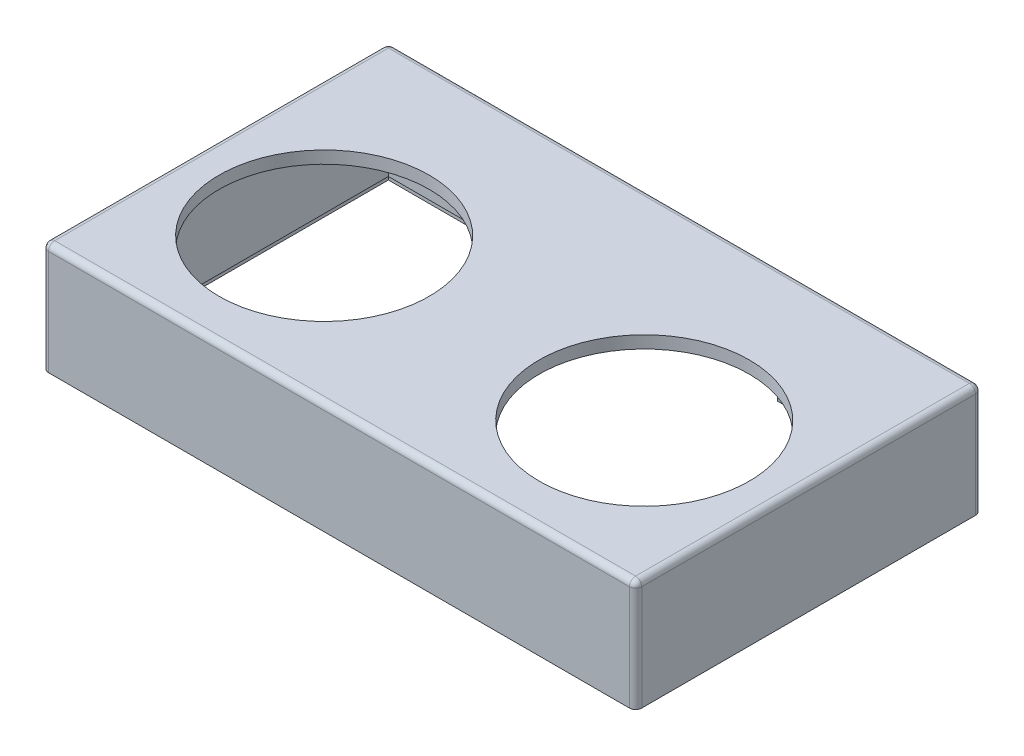
ISO-10303-21;
HEADER;
FILE_DESCRIPTION(('STEP AP214'),'2;1');
FILE_NAME('part.step','',(''),(''),'','','');
FILE_SCHEMA(('AUTOMOTIVE_DESIGN { 1 0 10303 214 1 1 1 1 }'));
ENDSEC;
DATA;
#1=APPLICATION_CONTEXT('core data for automotive mechanical design processes');
#2=APPLICATION_PROTOCOL_DEFINITION('international standard','automotive_design',2000,#1);
#3=PRODUCT_CONTEXT('',#1,'mechanical');
#4=PRODUCT('Part','Part','',(#3));
#5=PRODUCT_RELATED_PRODUCT_CATEGORY('part','',(#4));
#6=PRODUCT_DEFINITION_FORMATION('','',#4);
#7=PRODUCT_DEFINITION_CONTEXT('part definition',#1,'design');
#8=PRODUCT_DEFINITION('design','',#6,#7);
#9=PRODUCT_DEFINITION_SHAPE('','',#8);
#10=(LENGTH_UNIT() NAMED_UNIT(*) SI_UNIT(.MILLI.,.METRE.));
#11=(NAMED_UNIT(*) PLANE_ANGLE_UNIT() SI_UNIT($,.RADIAN.));
#12=(NAMED_UNIT(*) SI_UNIT($,.STERADIAN.) SOLID_ANGLE_UNIT());
#13=UNCERTAINTY_MEASURE_WITH_UNIT(LENGTH_MEASURE(1.E-05),#10,'distance_accuracy_value','');
#14=(GEOMETRIC_REPRESENTATION_CONTEXT(3) GLOBAL_UNCERTAINTY_ASSIGNED_CONTEXT((#13)) GLOBAL_UNIT_ASSIGNED_CONTEXT((#10,
#11,#12)) REPRESENTATION_CONTEXT('',''));
#15=CARTESIAN_POINT('',(0.,0.,0.));
#16=DIRECTION('',(0.,0.,1.));
#17=DIRECTION('',(1.,0.,0.));
#18=AXIS2_PLACEMENT_3D('',#15,#16,#17);
#19=CARTESIAN_POINT('',(-23.25,1.,-13.25));
#20=DIRECTION('',(0.,0.,-1.));
#21=DIRECTION('',(-1.,0.,0.));
#22=AXIS2_PLACEMENT_3D('',#19,#20,#21);
#23=PLANE('',#22);
#24=DIRECTION('',(1.,0.,0.));
#25=VECTOR('',#24,1.);
#26=CARTESIAN_POINT('',(-23.25,0.,-13.25));
#27=LINE('',#26,#25);
#28=CARTESIAN_POINT('',(-23.25,0.,-13.25));
#29=VERTEX_POINT('',#28);
#30=CARTESIAN_POINT('',(0.999999999999999,0.,-13.25));
#31=VERTEX_POINT('',#30);
#32=EDGE_CURVE('E708',#29,#31,#27,.T.);
#33=ORIENTED_EDGE('',*,*,#32,.T.);
#34=DIRECTION('',(0.,1.,0.));
#35=VECTOR('',#34,1.);
#36=CARTESIAN_POINT('',(0.999999999999997,1.,-13.25));
#37=LINE('',#36,#35);
#38=CARTESIAN_POINT('',(0.999999999999997,1.,-13.25));
#39=VERTEX_POINT('',#38);
#40=EDGE_CURVE('E202',#31,#39,#37,.T.);
#41=ORIENTED_EDGE('',*,*,#40,.T.);
#42=DIRECTION('',(1.,0.,0.));
#43=VECTOR('',#42,1.);
#44=CARTESIAN_POINT('',(-23.25,1.,-13.25));
#45=LINE('',#44,#43);
#46=CARTESIAN_POINT('',(-23.25,1.,-13.25));
#47=VERTEX_POINT('',#46);
#48=EDGE_CURVE('E715',#47,#39,#45,.T.);
#49=ORIENTED_EDGE('',*,*,#48,.F.);
#50=DIRECTION('',(0.,-1.,0.));
#51=VECTOR('',#50,1.);
#52=CARTESIAN_POINT('',(-23.25,1.,-13.25));
#53=LINE('',#52,#51);
#54=EDGE_CURVE('E732',#47,#29,#53,.T.);
#55=ORIENTED_EDGE('',*,*,#54,.T.);
#56=EDGE_LOOP('',(#33,#41,#49,#55));
#57=FACE_BOUND('',#56,.T.);
#58=ADVANCED_FACE('F35',(#57),#23,.F.);
#59=CARTESIAN_POINT('',(24.,9.,14.));
#60=DIRECTION('',(-1.,0.,0.));
#61=DIRECTION('',(0.,0.,1.));
#62=AXIS2_PLACEMENT_3D('',#59,#60,#61);
#63=PLANE('',#62);
#64=DIRECTION('',(0.,0.,-1.));
#65=VECTOR('',#64,1.);
#66=CARTESIAN_POINT('',(24.,0.,14.));
#67=LINE('',#66,#65);
#68=CARTESIAN_POINT('',(24.,0.,13.5));
#69=VERTEX_POINT('',#68);
#70=CARTESIAN_POINT('',(24.,0.,-13.5));
#71=VERTEX_POINT('',#70);
#72=EDGE_CURVE('E225',#69,#71,#67,.T.);
#73=ORIENTED_EDGE('',*,*,#72,.T.);
#74=DIRECTION('',(0.,-1.,0.));
#75=VECTOR('',#74,1.);
#76=CARTESIAN_POINT('',(24.,9.,-13.5));
#77=LINE('',#76,#75);
#78=CARTESIAN_POINT('',(24.,8.5,-13.5));
#79=VERTEX_POINT('',#78);
#80=EDGE_CURVE('E270',#71,#79,#77,.F.);
#81=ORIENTED_EDGE('',*,*,#80,.T.);
#82=DIRECTION('',(0.,0.,-1.));
#83=VECTOR('',#82,1.);
#84=CARTESIAN_POINT('',(24.,8.5,14.));
#85=LINE('',#84,#83);
#86=CARTESIAN_POINT('',(24.,8.5,13.5));
#87=VERTEX_POINT('',#86);
#88=EDGE_CURVE('E267',#79,#87,#85,.F.);
#89=ORIENTED_EDGE('',*,*,#88,.T.);
#90=DIRECTION('',(0.,-1.,0.));
#91=VECTOR('',#90,1.);
#92=CARTESIAN_POINT('',(24.,9.,13.5));
#93=LINE('',#92,#91);
#94=EDGE_CURVE('E265',#87,#69,#93,.T.);
#95=ORIENTED_EDGE('',*,*,#94,.T.);
#96=EDGE_LOOP('',(#73,#81,#89,#95));
#97=FACE_BOUND('',#96,.T.);
#98=ADVANCED_FACE('F383',(#97),#63,.F.);
#99=CARTESIAN_POINT('',(-24.,9.,-14.));
#100=DIRECTION('',(0.,0.,1.));
#101=DIRECTION('',(1.,0.,0.));
#102=AXIS2_PLACEMENT_3D('',#99,#100,#101);
#103=PLANE('',#102);
#104=DIRECTION('',(-1.,0.,0.));
#105=VECTOR('',#104,1.);
#106=CARTESIAN_POINT('',(-24.,8.5,-14.));
#107=LINE('',#106,#105);
#108=CARTESIAN_POINT('',(-23.5,8.5,-14.));
#109=VERTEX_POINT('',#108);
#110=CARTESIAN_POINT('',(23.5,8.5,-14.));
#111=VERTEX_POINT('',#110);
#112=EDGE_CURVE('E274',#109,#111,#107,.F.);
#113=ORIENTED_EDGE('',*,*,#112,.T.);
#114=DIRECTION('',(0.,-1.,0.));
#115=VECTOR('',#114,1.);
#116=CARTESIAN_POINT('',(23.5,9.,-14.));
#117=LINE('',#116,#115);
#118=CARTESIAN_POINT('',(23.5,0.,-14.));
#119=VERTEX_POINT('',#118);
#120=EDGE_CURVE('E276',#111,#119,#117,.T.);
#121=ORIENTED_EDGE('',*,*,#120,.T.);
#122=DIRECTION('',(-1.,0.,0.));
#123=VECTOR('',#122,1.);
#124=CARTESIAN_POINT('',(-24.,0.,-14.));
#125=LINE('',#124,#123);
#126=CARTESIAN_POINT('',(9.,0.,-14.));
#127=VERTEX_POINT('',#126);
#128=EDGE_CURVE('E224',#119,#127,#125,.T.);
#129=ORIENTED_EDGE('',*,*,#128,.T.);
#130=DIRECTION('',(0.,1.,0.));
#131=VECTOR('',#130,1.);
#132=CARTESIAN_POINT('',(9.,0.,-14.));
#133=LINE('',#132,#131);
#134=CARTESIAN_POINT('',(9.,3.5,-14.));
#135=VERTEX_POINT('',#134);
#136=EDGE_CURVE('E217',#127,#135,#133,.T.);
#137=ORIENTED_EDGE('',*,*,#136,.T.);
#138=DIRECTION('',(-1.,0.,0.));
#139=VECTOR('',#138,1.);
#140=CARTESIAN_POINT('',(9.,3.5,-14.));
#141=LINE('',#140,#139);
#142=CARTESIAN_POINT('',(0.999999999999999,3.5,-14.));
#143=VERTEX_POINT('',#142);
#144=EDGE_CURVE('E208',#135,#143,#141,.T.);
#145=ORIENTED_EDGE('',*,*,#144,.T.);
#146=DIRECTION('',(0.,-1.,0.));
#147=VECTOR('',#146,1.);
#148=CARTESIAN_POINT('',(0.999999999999999,0.,-14.));
#149=LINE('',#148,#147);
#150=CARTESIAN_POINT('',(0.999999999999999,0.,-14.));
#151=VERTEX_POINT('',#150);
#152=EDGE_CURVE('E199',#143,#151,#149,.T.);
#153=ORIENTED_EDGE('',*,*,#152,.T.);
#154=CARTESIAN_POINT('',(-23.5,0.,-14.));
#155=VERTEX_POINT('',#154);
#156=EDGE_CURVE('E213',#151,#155,#125,.T.);
#157=ORIENTED_EDGE('',*,*,#156,.T.);
#158=DIRECTION('',(0.,-1.,0.));
#159=VECTOR('',#158,1.);
#160=CARTESIAN_POINT('',(-23.5,9.,-14.));
#161=LINE('',#160,#159);
#162=EDGE_CURVE('E272',#155,#109,#161,.F.);
#163=ORIENTED_EDGE('',*,*,#162,.T.);
#164=EDGE_LOOP('',(#113,#121,#129,#137,#145,#153,#157,#163));
#165=FACE_BOUND('',#164,.T.);
#166=ADVANCED_FACE('F212',(#165),#103,.F.);
#167=CARTESIAN_POINT('',(-24.,9.,14.));
#168=DIRECTION('',(1.,0.,0.));
#169=DIRECTION('',(0.,0.,-1.));
#170=AXIS2_PLACEMENT_3D('',#167,#168,#169);
#171=PLANE('',#170);
#172=DIRECTION('',(0.,0.,1.));
#173=VECTOR('',#172,1.);
#174=CARTESIAN_POINT('',(-24.,8.5,14.));
#175=LINE('',#174,#173);
#176=CARTESIAN_POINT('',(-24.,8.5,13.5));
#177=VERTEX_POINT('',#176);
#178=CARTESIAN_POINT('',(-24.,8.5,-13.5));
#179=VERTEX_POINT('',#178);
#180=EDGE_CURVE('E44',#177,#179,#175,.F.);
#181=ORIENTED_EDGE('',*,*,#180,.T.);
#182=DIRECTION('',(0.,-1.,0.));
#183=VECTOR('',#182,1.);
#184=CARTESIAN_POINT('',(-24.,9.,-13.5));
#185=LINE('',#184,#183);
#186=CARTESIAN_POINT('',(-24.,0.,-13.5));
#187=VERTEX_POINT('',#186);
#188=EDGE_CURVE('E11',#179,#187,#185,.T.);
#189=ORIENTED_EDGE('',*,*,#188,.T.);
#190=DIRECTION('',(0.,0.,1.));
#191=VECTOR('',#190,1.);
#192=CARTESIAN_POINT('',(-24.,0.,14.));
#193=LINE('',#192,#191);
#194=CARTESIAN_POINT('',(-24.,0.,13.5));
#195=VERTEX_POINT('',#194);
#196=EDGE_CURVE('E227',#187,#195,#193,.T.);
#197=ORIENTED_EDGE('',*,*,#196,.T.);
#198=DIRECTION('',(0.,-1.,0.));
#199=VECTOR('',#198,1.);
#200=CARTESIAN_POINT('',(-24.,9.,13.5));
#201=LINE('',#200,#199);
#202=EDGE_CURVE('E55',#195,#177,#201,.F.);
#203=ORIENTED_EDGE('',*,*,#202,.T.);
#204=EDGE_LOOP('',(#181,#189,#197,#203));
#205=FACE_BOUND('',#204,.T.);
#206=ADVANCED_FACE('F353',(#205),#171,.F.);
#207=CARTESIAN_POINT('',(-24.,9.,14.));
#208=DIRECTION('',(0.,0.,-1.));
#209=DIRECTION('',(-1.,0.,0.));
#210=AXIS2_PLACEMENT_3D('',#207,#208,#209);
#211=PLANE('',#210);
#212=DIRECTION('',(1.,0.,0.));
#213=VECTOR('',#212,1.);
#214=CARTESIAN_POINT('',(-24.,0.,14.));
#215=LINE('',#214,#213);
#216=CARTESIAN_POINT('',(-23.5,0.,14.));
#217=VERTEX_POINT('',#216);
#218=CARTESIAN_POINT('',(23.5,0.,14.));
#219=VERTEX_POINT('',#218);
#220=EDGE_CURVE('E234',#217,#219,#215,.T.);
#221=ORIENTED_EDGE('',*,*,#220,.T.);
#222=DIRECTION('',(0.,-1.,0.));
#223=VECTOR('',#222,1.);
#224=CARTESIAN_POINT('',(23.5,9.,14.));
#225=LINE('',#224,#223);
#226=CARTESIAN_POINT('',(23.5,8.5,14.));
#227=VERTEX_POINT('',#226);
#228=EDGE_CURVE('E289',#219,#227,#225,.F.);
#229=ORIENTED_EDGE('',*,*,#228,.T.);
#230=DIRECTION('',(1.,0.,0.));
#231=VECTOR('',#230,1.);
#232=CARTESIAN_POINT('',(-24.,8.5,14.));
#233=LINE('',#232,#231);
#234=CARTESIAN_POINT('',(-23.5,8.5,14.));
#235=VERTEX_POINT('',#234);
#236=EDGE_CURVE('E285',#227,#235,#233,.F.);
#237=ORIENTED_EDGE('',*,*,#236,.T.);
#238=DIRECTION('',(0.,-1.,0.));
#239=VECTOR('',#238,1.);
#240=CARTESIAN_POINT('',(-23.5,9.,14.));
#241=LINE('',#240,#239);
#242=EDGE_CURVE('E287',#235,#217,#241,.T.);
#243=ORIENTED_EDGE('',*,*,#242,.T.);
#244=EDGE_LOOP('',(#221,#229,#237,#243));
#245=FACE_BOUND('',#244,.T.);
#246=ADVANCED_FACE('F357',(#245),#211,.F.);
#247=CARTESIAN_POINT('',(0.,9.,0.));
#248=DIRECTION('',(0.,-1.,0.));
#249=DIRECTION('',(0.,0.,-1.));
#250=AXIS2_PLACEMENT_3D('',#247,#248,#249);
#251=PLANE('',#250);
#252=DIRECTION('',(1.,0.,0.));
#253=VECTOR('',#252,1.);
#254=CARTESIAN_POINT('',(0.,9.,13.5));
#255=LINE('',#254,#253);
#256=CARTESIAN_POINT('',(-23.5,9.,13.5));
#257=VERTEX_POINT('',#256);
#258=CARTESIAN_POINT('',(23.5,9.,13.5));
#259=VERTEX_POINT('',#258);
#260=EDGE_CURVE('E256',#257,#259,#255,.T.);
#261=ORIENTED_EDGE('',*,*,#260,.T.);
#262=DIRECTION('',(0.,0.,-1.));
#263=VECTOR('',#262,1.);
#264=CARTESIAN_POINT('',(23.5,9.,0.));
#265=LINE('',#264,#263);
#266=CARTESIAN_POINT('',(23.5,9.,-13.5));
#267=VERTEX_POINT('',#266);
#268=EDGE_CURVE('E262',#259,#267,#265,.T.);
#269=ORIENTED_EDGE('',*,*,#268,.T.);
#270=DIRECTION('',(-1.,0.,0.));
#271=VECTOR('',#270,1.);
#272=CARTESIAN_POINT('',(0.,9.,-13.5));
#273=LINE('',#272,#271);
#274=CARTESIAN_POINT('',(-23.5,9.,-13.5));
#275=VERTEX_POINT('',#274);
#276=EDGE_CURVE('E260',#267,#275,#273,.T.);
#277=ORIENTED_EDGE('',*,*,#276,.T.);
#278=DIRECTION('',(0.,0.,1.));
#279=VECTOR('',#278,1.);
#280=CARTESIAN_POINT('',(-23.5,9.,0.));
#281=LINE('',#280,#279);
#282=EDGE_CURVE('E258',#275,#257,#281,.T.);
#283=ORIENTED_EDGE('',*,*,#282,.T.);
#284=EDGE_LOOP('',(#261,#269,#277,#283));
#285=FACE_BOUND('',#284,.T.);
#286=CARTESIAN_POINT('',(12.95,9.,2.25));
#287=DIRECTION('',(0.,1.,0.));
#288=DIRECTION('',(0.,0.,1.));
#289=AXIS2_PLACEMENT_3D('',#286,#287,#288);
#290=CIRCLE('',#289,8.5);
#291=CARTESIAN_POINT('',(12.95,9.,10.75));
#292=VERTEX_POINT('',#291);
#293=EDGE_CURVE('E246',#292,#292,#290,.T.);
#294=ORIENTED_EDGE('',*,*,#293,.F.);
#295=EDGE_LOOP('',(#294));
#296=FACE_BOUND('',#295,.T.);
#297=CARTESIAN_POINT('',(-12.95,9.,2.25));
#298=DIRECTION('',(0.,1.,0.));
#299=DIRECTION('',(0.,0.,1.));
#300=AXIS2_PLACEMENT_3D('',#297,#298,#299);
#301=CIRCLE('',#300,8.5);
#302=CARTESIAN_POINT('',(-12.95,9.,10.75));
#303=VERTEX_POINT('',#302);
#304=EDGE_CURVE('E242',#303,#303,#301,.T.);
#305=ORIENTED_EDGE('',*,*,#304,.F.);
#306=EDGE_LOOP('',(#305));
#307=FACE_BOUND('',#306,.T.);
#308=ADVANCED_FACE('F338',(#285,#296,#307),#251,.F.);
#309=CARTESIAN_POINT('',(0.,0.,0.));
#310=DIRECTION('',(0.,-1.,0.));
#311=DIRECTION('',(0.,0.,-1.));
#312=AXIS2_PLACEMENT_3D('',#309,#310,#311);
#313=PLANE('',#312);
#314=ORIENTED_EDGE('',*,*,#128,.F.);
#315=CARTESIAN_POINT('',(23.5,0.,-13.5));
#316=DIRECTION('',(0.,-1.,0.));
#317=DIRECTION('',(0.,0.,-1.));
#318=AXIS2_PLACEMENT_3D('',#315,#316,#317);
#319=CIRCLE('',#318,0.5);
#320=EDGE_CURVE('E283',#119,#71,#319,.T.);
#321=ORIENTED_EDGE('',*,*,#320,.T.);
#322=ORIENTED_EDGE('',*,*,#72,.F.);
#323=CARTESIAN_POINT('',(23.5,0.,13.5));
#324=DIRECTION('',(0.,-1.,0.));
#325=DIRECTION('',(0.,0.,-1.));
#326=AXIS2_PLACEMENT_3D('',#323,#324,#325);
#327=CIRCLE('',#326,0.5);
#328=EDGE_CURVE('E281',#69,#219,#327,.T.);
#329=ORIENTED_EDGE('',*,*,#328,.T.);
#330=ORIENTED_EDGE('',*,*,#220,.F.);
#331=CARTESIAN_POINT('',(-23.5,0.,13.5));
#332=DIRECTION('',(0.,-1.,0.));
#333=DIRECTION('',(0.,0.,-1.));
#334=AXIS2_PLACEMENT_3D('',#331,#332,#333);
#335=CIRCLE('',#334,0.5);
#336=EDGE_CURVE('E278',#217,#195,#335,.T.);
#337=ORIENTED_EDGE('',*,*,#336,.T.);
#338=ORIENTED_EDGE('',*,*,#196,.F.);
#339=CARTESIAN_POINT('',(-23.5,0.,-13.5));
#340=DIRECTION('',(0.,-1.,0.));
#341=DIRECTION('',(0.,0.,-1.));
#342=AXIS2_PLACEMENT_3D('',#339,#340,#341);
#343=CIRCLE('',#342,0.5);
#344=EDGE_CURVE('E223',#187,#155,#343,.T.);
#345=ORIENTED_EDGE('',*,*,#344,.T.);
#346=ORIENTED_EDGE('',*,*,#156,.F.);
#347=DIRECTION('',(0.,0.,1.));
#348=VECTOR('',#347,1.);
#349=CARTESIAN_POINT('',(0.999999999999999,0.,-14.));
#350=LINE('',#349,#348);
#351=EDGE_CURVE('E195',#151,#31,#350,.T.);
#352=ORIENTED_EDGE('',*,*,#351,.T.);
#353=ORIENTED_EDGE('',*,*,#32,.F.);
#354=DIRECTION('',(0.,0.,-1.));
#355=VECTOR('',#354,1.);
#356=CARTESIAN_POINT('',(-23.25,0.,-13.25));
#357=LINE('',#356,#355);
#358=CARTESIAN_POINT('',(-23.25,0.,13.25));
#359=VERTEX_POINT('',#358);
#360=EDGE_CURVE('E723',#359,#29,#357,.T.);
#361=ORIENTED_EDGE('',*,*,#360,.F.);
#362=DIRECTION('',(-1.,0.,0.));
#363=VECTOR('',#362,1.);
#364=CARTESIAN_POINT('',(-23.25,0.,13.25));
#365=LINE('',#364,#363);
#366=CARTESIAN_POINT('',(23.25,0.,13.25));
#367=VERTEX_POINT('',#366);
#368=EDGE_CURVE('E720',#367,#359,#365,.T.);
#369=ORIENTED_EDGE('',*,*,#368,.F.);
#370=DIRECTION('',(0.,0.,1.));
#371=VECTOR('',#370,1.);
#372=CARTESIAN_POINT('',(23.25,0.,-13.25));
#373=LINE('',#372,#371);
#374=CARTESIAN_POINT('',(23.25,0.,-13.25));
#375=VERTEX_POINT('',#374);
#376=EDGE_CURVE('E703',#375,#367,#373,.T.);
#377=ORIENTED_EDGE('',*,*,#376,.F.);
#378=CARTESIAN_POINT('',(8.99999999999998,0.,-13.25));
#379=VERTEX_POINT('',#378);
#380=EDGE_CURVE('E726',#379,#375,#27,.T.);
#381=ORIENTED_EDGE('',*,*,#380,.F.);
#382=DIRECTION('',(0.,0.,1.));
#383=VECTOR('',#382,1.);
#384=CARTESIAN_POINT('',(9.,0.,-14.));
#385=LINE('',#384,#383);
#386=EDGE_CURVE('E207',#127,#379,#385,.T.);
#387=ORIENTED_EDGE('',*,*,#386,.F.);
#388=EDGE_LOOP('',(#314,#321,#322,#329,#330,#337,#338,#345,#346,#352,#353,#361,#369,#377,#381,#387));
#389=FACE_BOUND('',#388,.T.);
#390=ADVANCED_FACE('F220',(#389),#313,.T.);
#391=CARTESIAN_POINT('',(22.5,8.,-12.5));
#392=DIRECTION('',(1.,0.,0.));
#393=DIRECTION('',(0.,0.,-1.));
#394=AXIS2_PLACEMENT_3D('',#391,#392,#393);
#395=PLANE('',#394);
#396=DIRECTION('',(0.,-1.,0.));
#397=VECTOR('',#396,1.);
#398=CARTESIAN_POINT('',(22.5,8.,-12.5));
#399=LINE('',#398,#397);
#400=CARTESIAN_POINT('',(22.5,8.,-12.5));
#401=VERTEX_POINT('',#400);
#402=CARTESIAN_POINT('',(22.5,1.,-12.5));
#403=VERTEX_POINT('',#402);
#404=EDGE_CURVE('E229',#401,#403,#399,.T.);
#405=ORIENTED_EDGE('',*,*,#404,.T.);
#406=DIRECTION('',(0.,0.,1.));
#407=VECTOR('',#406,1.);
#408=CARTESIAN_POINT('',(22.5,1.,-12.5));
#409=LINE('',#408,#407);
#410=CARTESIAN_POINT('',(22.5,1.,12.5));
#411=VERTEX_POINT('',#410);
#412=EDGE_CURVE('E744',#403,#411,#409,.T.);
#413=ORIENTED_EDGE('',*,*,#412,.T.);
#414=DIRECTION('',(0.,-1.,0.));
#415=VECTOR('',#414,1.);
#416=CARTESIAN_POINT('',(22.5,8.,12.5));
#417=LINE('',#416,#415);
#418=CARTESIAN_POINT('',(22.5,8.,12.5));
#419=VERTEX_POINT('',#418);
#420=EDGE_CURVE('E762',#419,#411,#417,.T.);
#421=ORIENTED_EDGE('',*,*,#420,.F.);
#422=DIRECTION('',(0.,0.,1.));
#423=VECTOR('',#422,1.);
#424=CARTESIAN_POINT('',(22.5,8.,-12.5));
#425=LINE('',#424,#423);
#426=EDGE_CURVE('E241',#401,#419,#425,.T.);
#427=ORIENTED_EDGE('',*,*,#426,.F.);
#428=EDGE_LOOP('',(#405,#413,#421,#427));
#429=FACE_BOUND('',#428,.T.);
#430=ADVANCED_FACE('F467',(#429),#395,.F.);
#431=CARTESIAN_POINT('',(-22.5,8.,-12.5));
#432=DIRECTION('',(0.,0.,-1.));
#433=DIRECTION('',(-1.,0.,0.));
#434=AXIS2_PLACEMENT_3D('',#431,#432,#433);
#435=PLANE('',#434);
#436=DIRECTION('',(1.,0.,0.));
#437=VECTOR('',#436,1.);
#438=CARTESIAN_POINT('',(-22.5,1.,-12.5));
#439=LINE('',#438,#437);
#440=CARTESIAN_POINT('',(-22.5,1.,-12.5));
#441=VERTEX_POINT('',#440);
#442=CARTESIAN_POINT('',(0.999999999999999,1.,-12.5));
#443=VERTEX_POINT('',#442);
#444=EDGE_CURVE('E741',#441,#443,#439,.T.);
#445=ORIENTED_EDGE('',*,*,#444,.T.);
#446=DIRECTION('',(0.,1.,0.));
#447=VECTOR('',#446,1.);
#448=CARTESIAN_POINT('',(1.,8.,-12.5));
#449=LINE('',#448,#447);
#450=CARTESIAN_POINT('',(0.999999999999999,3.5,-12.5));
#451=VERTEX_POINT('',#450);
#452=EDGE_CURVE('E701',#443,#451,#449,.T.);
#453=ORIENTED_EDGE('',*,*,#452,.T.);
#454=DIRECTION('',(1.,0.,0.));
#455=VECTOR('',#454,1.);
#456=CARTESIAN_POINT('',(-22.5,3.5,-12.5));
#457=LINE('',#456,#455);
#458=CARTESIAN_POINT('',(9.,3.5,-12.5));
#459=VERTEX_POINT('',#458);
#460=EDGE_CURVE('E253',#451,#459,#457,.T.);
#461=ORIENTED_EDGE('',*,*,#460,.T.);
#462=DIRECTION('',(0.,-1.,0.));
#463=VECTOR('',#462,1.);
#464=CARTESIAN_POINT('',(9.,8.,-12.5));
#465=LINE('',#464,#463);
#466=CARTESIAN_POINT('',(9.,1.,-12.5));
#467=VERTEX_POINT('',#466);
#468=EDGE_CURVE('E689',#459,#467,#465,.T.);
#469=ORIENTED_EDGE('',*,*,#468,.T.);
#470=EDGE_CURVE('E740',#467,#403,#439,.T.);
#471=ORIENTED_EDGE('',*,*,#470,.T.);
#472=ORIENTED_EDGE('',*,*,#404,.F.);
#473=DIRECTION('',(1.,0.,0.));
#474=VECTOR('',#473,1.);
#475=CARTESIAN_POINT('',(-22.5,8.,-12.5));
#476=LINE('',#475,#474);
#477=CARTESIAN_POINT('',(-22.5,8.,-12.5));
#478=VERTEX_POINT('',#477);
#479=EDGE_CURVE('E759',#478,#401,#476,.T.);
#480=ORIENTED_EDGE('',*,*,#479,.F.);
#481=DIRECTION('',(0.,-1.,0.));
#482=VECTOR('',#481,1.);
#483=CARTESIAN_POINT('',(-22.5,8.,-12.5));
#484=LINE('',#483,#482);
#485=EDGE_CURVE('E765',#478,#441,#484,.T.);
#486=ORIENTED_EDGE('',*,*,#485,.T.);
#487=EDGE_LOOP('',(#445,#453,#461,#469,#471,#472,#480,#486));
#488=FACE_BOUND('',#487,.T.);
#489=ADVANCED_FACE('F463',(#488),#435,.F.);
#490=CARTESIAN_POINT('',(-22.5,8.,-12.5));
#491=DIRECTION('',(-1.,0.,0.));
#492=DIRECTION('',(0.,0.,1.));
#493=AXIS2_PLACEMENT_3D('',#490,#491,#492);
#494=PLANE('',#493);
#495=DIRECTION('',(0.,-1.,0.));
#496=VECTOR('',#495,1.);
#497=CARTESIAN_POINT('',(-22.5,8.,12.5));
#498=LINE('',#497,#496);
#499=CARTESIAN_POINT('',(-22.5,8.,12.5));
#500=VERTEX_POINT('',#499);
#501=CARTESIAN_POINT('',(-22.5,1.,12.5));
#502=VERTEX_POINT('',#501);
#503=EDGE_CURVE('E768',#500,#502,#498,.T.);
#504=ORIENTED_EDGE('',*,*,#503,.T.);
#505=DIRECTION('',(0.,0.,-1.));
#506=VECTOR('',#505,1.);
#507=CARTESIAN_POINT('',(-22.5,1.,-12.5));
#508=LINE('',#507,#506);
#509=EDGE_CURVE('E731',#502,#441,#508,.T.);
#510=ORIENTED_EDGE('',*,*,#509,.T.);
#511=ORIENTED_EDGE('',*,*,#485,.F.);
#512=DIRECTION('',(0.,0.,-1.));
#513=VECTOR('',#512,1.);
#514=CARTESIAN_POINT('',(-22.5,8.,-12.5));
#515=LINE('',#514,#513);
#516=EDGE_CURVE('E756',#500,#478,#515,.T.);
#517=ORIENTED_EDGE('',*,*,#516,.F.);
#518=EDGE_LOOP('',(#504,#510,#511,#517));
#519=FACE_BOUND('',#518,.T.);
#520=ADVANCED_FACE('F466',(#519),#494,.F.);
#521=CARTESIAN_POINT('',(-22.5,8.,12.5));
#522=DIRECTION('',(0.,0.,1.));
#523=DIRECTION('',(1.,0.,0.));
#524=AXIS2_PLACEMENT_3D('',#521,#522,#523);
#525=PLANE('',#524);
#526=ORIENTED_EDGE('',*,*,#420,.T.);
#527=DIRECTION('',(-1.,0.,0.));
#528=VECTOR('',#527,1.);
#529=CARTESIAN_POINT('',(-22.5,1.,12.5));
#530=LINE('',#529,#528);
#531=EDGE_CURVE('E237',#411,#502,#530,.T.);
#532=ORIENTED_EDGE('',*,*,#531,.T.);
#533=ORIENTED_EDGE('',*,*,#503,.F.);
#534=DIRECTION('',(-1.,0.,0.));
#535=VECTOR('',#534,1.);
#536=CARTESIAN_POINT('',(-22.5,8.,12.5));
#537=LINE('',#536,#535);
#538=EDGE_CURVE('E753',#419,#500,#537,.T.);
#539=ORIENTED_EDGE('',*,*,#538,.F.);
#540=EDGE_LOOP('',(#526,#532,#533,#539));
#541=FACE_BOUND('',#540,.T.);
#542=ADVANCED_FACE('F461',(#541),#525,.F.);
#543=CARTESIAN_POINT('',(0.,8.,0.));
#544=DIRECTION('',(0.,1.,0.));
#545=DIRECTION('',(0.,0.,1.));
#546=AXIS2_PLACEMENT_3D('',#543,#544,#545);
#547=PLANE('',#546);
#548=CARTESIAN_POINT('',(12.95,8.,2.25));
#549=DIRECTION('',(0.,1.,0.));
#550=DIRECTION('',(0.,0.,1.));
#551=AXIS2_PLACEMENT_3D('',#548,#549,#550);
#552=CIRCLE('',#551,8.5);
#553=CARTESIAN_POINT('',(12.95,8.,10.75));
#554=VERTEX_POINT('',#553);
#555=EDGE_CURVE('E243',#554,#554,#552,.T.);
#556=ORIENTED_EDGE('',*,*,#555,.T.);
#557=EDGE_LOOP('',(#556));
#558=FACE_BOUND('',#557,.T.);
#559=CARTESIAN_POINT('',(-12.95,8.,2.25));
#560=DIRECTION('',(0.,1.,0.));
#561=DIRECTION('',(0.,0.,1.));
#562=AXIS2_PLACEMENT_3D('',#559,#560,#561);
#563=CIRCLE('',#562,8.5);
#564=CARTESIAN_POINT('',(-12.95,8.,10.75));
#565=VERTEX_POINT('',#564);
#566=EDGE_CURVE('E238',#565,#565,#563,.T.);
#567=ORIENTED_EDGE('',*,*,#566,.T.);
#568=EDGE_LOOP('',(#567));
#569=FACE_BOUND('',#568,.T.);
#570=ORIENTED_EDGE('',*,*,#426,.T.);
#571=ORIENTED_EDGE('',*,*,#538,.T.);
#572=ORIENTED_EDGE('',*,*,#516,.T.);
#573=ORIENTED_EDGE('',*,*,#479,.T.);
#574=EDGE_LOOP('',(#570,#571,#572,#573));
#575=FACE_BOUND('',#574,.T.);
#576=ADVANCED_FACE('F457',(#558,#569,#575),#547,.F.);
#577=CARTESIAN_POINT('',(-12.95,-13.,2.25));
#578=DIRECTION('',(0.,1.,0.));
#579=DIRECTION('',(0.,0.,1.));
#580=AXIS2_PLACEMENT_3D('',#577,#578,#579);
#581=CYLINDRICAL_SURFACE('',#580,8.5);
#582=ORIENTED_EDGE('',*,*,#304,.T.);
#583=EDGE_LOOP('',(#582));
#584=FACE_BOUND('',#583,.T.);
#585=ORIENTED_EDGE('',*,*,#566,.F.);
#586=EDGE_LOOP('',(#585));
#587=FACE_BOUND('',#586,.T.);
#588=ADVANCED_FACE('F453',(#584,#587),#581,.F.);
#589=CARTESIAN_POINT('',(12.95,-13.,2.25));
#590=DIRECTION('',(0.,1.,0.));
#591=DIRECTION('',(0.,0.,1.));
#592=AXIS2_PLACEMENT_3D('',#589,#590,#591);
#593=CYLINDRICAL_SURFACE('',#592,8.5);
#594=ORIENTED_EDGE('',*,*,#293,.T.);
#595=EDGE_LOOP('',(#594));
#596=FACE_BOUND('',#595,.T.);
#597=ORIENTED_EDGE('',*,*,#555,.F.);
#598=EDGE_LOOP('',(#597));
#599=FACE_BOUND('',#598,.T.);
#600=ADVANCED_FACE('F435',(#596,#599),#593,.F.);
#601=CARTESIAN_POINT('',(0.,1.,0.));
#602=DIRECTION('',(0.,1.,0.));
#603=DIRECTION('',(0.,0.,1.));
#604=AXIS2_PLACEMENT_3D('',#601,#602,#603);
#605=PLANE('',#604);
#606=ORIENTED_EDGE('',*,*,#48,.T.);
#607=DIRECTION('',(0.,0.,1.));
#608=VECTOR('',#607,1.);
#609=CARTESIAN_POINT('',(0.999999999999999,1.,0.));
#610=LINE('',#609,#608);
#611=EDGE_CURVE('E698',#39,#443,#610,.T.);
#612=ORIENTED_EDGE('',*,*,#611,.T.);
#613=ORIENTED_EDGE('',*,*,#444,.F.);
#614=ORIENTED_EDGE('',*,*,#509,.F.);
#615=ORIENTED_EDGE('',*,*,#531,.F.);
#616=ORIENTED_EDGE('',*,*,#412,.F.);
#617=ORIENTED_EDGE('',*,*,#470,.F.);
#618=DIRECTION('',(0.,0.,-1.));
#619=VECTOR('',#618,1.);
#620=CARTESIAN_POINT('',(9.,1.,0.));
#621=LINE('',#620,#619);
#622=CARTESIAN_POINT('',(9.,1.,-13.25));
#623=VERTEX_POINT('',#622);
#624=EDGE_CURVE('E685',#467,#623,#621,.T.);
#625=ORIENTED_EDGE('',*,*,#624,.T.);
#626=CARTESIAN_POINT('',(23.25,1.,-13.25));
#627=VERTEX_POINT('',#626);
#628=EDGE_CURVE('E714',#623,#627,#45,.T.);
#629=ORIENTED_EDGE('',*,*,#628,.T.);
#630=DIRECTION('',(0.,0.,1.));
#631=VECTOR('',#630,1.);
#632=CARTESIAN_POINT('',(23.25,1.,-13.25));
#633=LINE('',#632,#631);
#634=CARTESIAN_POINT('',(23.25,1.,13.25));
#635=VERTEX_POINT('',#634);
#636=EDGE_CURVE('E704',#627,#635,#633,.T.);
#637=ORIENTED_EDGE('',*,*,#636,.T.);
#638=DIRECTION('',(-1.,0.,0.));
#639=VECTOR('',#638,1.);
#640=CARTESIAN_POINT('',(-23.25,1.,13.25));
#641=LINE('',#640,#639);
#642=CARTESIAN_POINT('',(-23.25,1.,13.25));
#643=VERTEX_POINT('',#642);
#644=EDGE_CURVE('E707',#635,#643,#641,.T.);
#645=ORIENTED_EDGE('',*,*,#644,.T.);
#646=DIRECTION('',(0.,0.,-1.));
#647=VECTOR('',#646,1.);
#648=CARTESIAN_POINT('',(-23.25,1.,-13.25));
#649=LINE('',#648,#647);
#650=EDGE_CURVE('E711',#643,#47,#649,.T.);
#651=ORIENTED_EDGE('',*,*,#650,.T.);
#652=EDGE_LOOP('',(#606,#612,#613,#614,#615,#616,#617,#625,#629,#637,#645,#651));
#653=FACE_BOUND('',#652,.T.);
#654=ADVANCED_FACE('F432',(#653),#605,.F.);
#655=CARTESIAN_POINT('',(23.25,1.,-13.25));
#656=DIRECTION('',(1.,0.,0.));
#657=DIRECTION('',(0.,0.,-1.));
#658=AXIS2_PLACEMENT_3D('',#655,#656,#657);
#659=PLANE('',#658);
#660=ORIENTED_EDGE('',*,*,#376,.T.);
#661=DIRECTION('',(0.,-1.,0.));
#662=VECTOR('',#661,1.);
#663=CARTESIAN_POINT('',(23.25,1.,13.25));
#664=LINE('',#663,#662);
#665=EDGE_CURVE('E718',#635,#367,#664,.T.);
#666=ORIENTED_EDGE('',*,*,#665,.F.);
#667=ORIENTED_EDGE('',*,*,#636,.F.);
#668=DIRECTION('',(0.,-1.,0.));
#669=VECTOR('',#668,1.);
#670=CARTESIAN_POINT('',(23.25,1.,-13.25));
#671=LINE('',#670,#669);
#672=EDGE_CURVE('E728',#627,#375,#671,.T.);
#673=ORIENTED_EDGE('',*,*,#672,.T.);
#674=EDGE_LOOP('',(#660,#666,#667,#673));
#675=FACE_BOUND('',#674,.T.);
#676=ADVANCED_FACE('F434',(#675),#659,.F.);
#677=ORIENTED_EDGE('',*,*,#628,.F.);
#678=DIRECTION('',(0.,-1.,0.));
#679=VECTOR('',#678,1.);
#680=CARTESIAN_POINT('',(9.,1.,-13.25));
#681=LINE('',#680,#679);
#682=EDGE_CURVE('E249',#623,#379,#681,.T.);
#683=ORIENTED_EDGE('',*,*,#682,.T.);
#684=ORIENTED_EDGE('',*,*,#380,.T.);
#685=ORIENTED_EDGE('',*,*,#672,.F.);
#686=EDGE_LOOP('',(#677,#683,#684,#685));
#687=FACE_BOUND('',#686,.T.);
#688=ADVANCED_FACE('F393',(#687),#23,.F.);
#689=CARTESIAN_POINT('',(-23.25,1.,-13.25));
#690=DIRECTION('',(-1.,0.,0.));
#691=DIRECTION('',(0.,0.,1.));
#692=AXIS2_PLACEMENT_3D('',#689,#690,#691);
#693=PLANE('',#692);
#694=ORIENTED_EDGE('',*,*,#360,.T.);
#695=ORIENTED_EDGE('',*,*,#54,.F.);
#696=ORIENTED_EDGE('',*,*,#650,.F.);
#697=DIRECTION('',(0.,-1.,0.));
#698=VECTOR('',#697,1.);
#699=CARTESIAN_POINT('',(-23.25,1.,13.25));
#700=LINE('',#699,#698);
#701=EDGE_CURVE('E734',#643,#359,#700,.T.);
#702=ORIENTED_EDGE('',*,*,#701,.T.);
#703=EDGE_LOOP('',(#694,#695,#696,#702));
#704=FACE_BOUND('',#703,.T.);
#705=ADVANCED_FACE('F439',(#704),#693,.F.);
#706=CARTESIAN_POINT('',(-23.25,1.,13.25));
#707=DIRECTION('',(0.,0.,1.));
#708=DIRECTION('',(1.,0.,0.));
#709=AXIS2_PLACEMENT_3D('',#706,#707,#708);
#710=PLANE('',#709);
#711=ORIENTED_EDGE('',*,*,#368,.T.);
#712=ORIENTED_EDGE('',*,*,#701,.F.);
#713=ORIENTED_EDGE('',*,*,#644,.F.);
#714=ORIENTED_EDGE('',*,*,#665,.T.);
#715=EDGE_LOOP('',(#711,#712,#713,#714));
#716=FACE_BOUND('',#715,.T.);
#717=ADVANCED_FACE('F443',(#716),#710,.F.);
#718=CARTESIAN_POINT('',(9.,3.5,-14.));
#719=DIRECTION('',(0.,1.,0.));
#720=DIRECTION('',(-1.,0.,0.));
#721=AXIS2_PLACEMENT_3D('',#718,#719,#720);
#722=PLANE('',#721);
#723=DIRECTION('',(0.,0.,1.));
#724=VECTOR('',#723,1.);
#725=CARTESIAN_POINT('',(0.999999999999999,3.5,-14.));
#726=LINE('',#725,#724);
#727=EDGE_CURVE('E682',#143,#451,#726,.T.);
#728=ORIENTED_EDGE('',*,*,#727,.F.);
#729=ORIENTED_EDGE('',*,*,#144,.F.);
#730=DIRECTION('',(0.,0.,1.));
#731=VECTOR('',#730,1.);
#732=CARTESIAN_POINT('',(9.,3.5,-14.));
#733=LINE('',#732,#731);
#734=EDGE_CURVE('E686',#135,#459,#733,.T.);
#735=ORIENTED_EDGE('',*,*,#734,.T.);
#736=ORIENTED_EDGE('',*,*,#460,.F.);
#737=EDGE_LOOP('',(#728,#729,#735,#736));
#738=FACE_BOUND('',#737,.T.);
#739=ADVANCED_FACE('F428',(#738),#722,.F.);
#740=CARTESIAN_POINT('',(0.999999999999999,0.,-14.));
#741=DIRECTION('',(-1.,0.,0.));
#742=DIRECTION('',(0.,0.,1.));
#743=AXIS2_PLACEMENT_3D('',#740,#741,#742);
#744=PLANE('',#743);
#745=ORIENTED_EDGE('',*,*,#611,.F.);
#746=ORIENTED_EDGE('',*,*,#40,.F.);
#747=ORIENTED_EDGE('',*,*,#351,.F.);
#748=ORIENTED_EDGE('',*,*,#152,.F.);
#749=ORIENTED_EDGE('',*,*,#727,.T.);
#750=ORIENTED_EDGE('',*,*,#452,.F.);
#751=EDGE_LOOP('',(#745,#746,#747,#748,#749,#750));
#752=FACE_BOUND('',#751,.T.);
#753=ADVANCED_FACE('F197',(#752),#744,.F.);
#754=CARTESIAN_POINT('',(9.,0.,-14.));
#755=DIRECTION('',(1.,0.,0.));
#756=DIRECTION('',(0.,0.,-1.));
#757=AXIS2_PLACEMENT_3D('',#754,#755,#756);
#758=PLANE('',#757);
#759=ORIENTED_EDGE('',*,*,#734,.F.);
#760=ORIENTED_EDGE('',*,*,#136,.F.);
#761=ORIENTED_EDGE('',*,*,#386,.T.);
#762=ORIENTED_EDGE('',*,*,#682,.F.);
#763=ORIENTED_EDGE('',*,*,#624,.F.);
#764=ORIENTED_EDGE('',*,*,#468,.F.);
#765=EDGE_LOOP('',(#759,#760,#761,#762,#763,#764));
#766=FACE_BOUND('',#765,.T.);
#767=ADVANCED_FACE('F419',(#766),#758,.F.);
#768=CARTESIAN_POINT('',(-23.5,9.,13.5));
#769=DIRECTION('',(0.,-1.,0.));
#770=DIRECTION('',(0.,0.,-1.));
#771=AXIS2_PLACEMENT_3D('',#768,#769,#770);
#772=CYLINDRICAL_SURFACE('',#771,0.5);
#773=ORIENTED_EDGE('',*,*,#336,.F.);
#774=ORIENTED_EDGE('',*,*,#242,.F.);
#775=CARTESIAN_POINT('',(-23.5,8.5,13.5));
#776=DIRECTION('',(0.,1.,0.));
#777=DIRECTION('',(0.,0.,1.));
#778=AXIS2_PLACEMENT_3D('',#775,#776,#777);
#779=CIRCLE('',#778,0.5);
#780=EDGE_CURVE('E39',#177,#235,#779,.T.);
#781=ORIENTED_EDGE('',*,*,#780,.F.);
#782=ORIENTED_EDGE('',*,*,#202,.F.);
#783=EDGE_LOOP('',(#773,#774,#781,#782));
#784=FACE_BOUND('',#783,.T.);
#785=ADVANCED_FACE('F37',(#784),#772,.T.);
#786=CARTESIAN_POINT('',(-23.5,8.5,0.));
#787=DIRECTION('',(0.,0.,1.));
#788=DIRECTION('',(1.,0.,0.));
#789=AXIS2_PLACEMENT_3D('',#786,#787,#788);
#790=CYLINDRICAL_SURFACE('',#789,0.5);
#791=CARTESIAN_POINT('',(-23.5,8.5,-13.5));
#792=DIRECTION('',(0.,0.,-1.));
#793=DIRECTION('',(-1.,0.,0.));
#794=AXIS2_PLACEMENT_3D('',#791,#792,#793);
#795=CIRCLE('',#794,0.5);
#796=EDGE_CURVE('E318',#179,#275,#795,.T.);
#797=ORIENTED_EDGE('',*,*,#796,.F.);
#798=ORIENTED_EDGE('',*,*,#180,.F.);
#799=CARTESIAN_POINT('',(-23.5,8.5,13.5));
#800=DIRECTION('',(0.,0.,1.));
#801=DIRECTION('',(1.,0.,0.));
#802=AXIS2_PLACEMENT_3D('',#799,#800,#801);
#803=CIRCLE('',#802,0.5);
#804=EDGE_CURVE('E320',#257,#177,#803,.T.);
#805=ORIENTED_EDGE('',*,*,#804,.F.);
#806=ORIENTED_EDGE('',*,*,#282,.F.);
#807=EDGE_LOOP('',(#797,#798,#805,#806));
#808=FACE_BOUND('',#807,.T.);
#809=ADVANCED_FACE('F345',(#808),#790,.T.);
#810=CARTESIAN_POINT('',(-23.5,9.,-13.5));
#811=DIRECTION('',(0.,-1.,0.));
#812=DIRECTION('',(0.,0.,-1.));
#813=AXIS2_PLACEMENT_3D('',#810,#811,#812);
#814=CYLINDRICAL_SURFACE('',#813,0.5);
#815=ORIENTED_EDGE('',*,*,#344,.F.);
#816=ORIENTED_EDGE('',*,*,#188,.F.);
#817=CARTESIAN_POINT('',(-23.5,8.5,-13.5));
#818=DIRECTION('',(0.,1.,0.));
#819=DIRECTION('',(0.,0.,1.));
#820=AXIS2_PLACEMENT_3D('',#817,#818,#819);
#821=CIRCLE('',#820,0.5);
#822=EDGE_CURVE('E315',#109,#179,#821,.T.);
#823=ORIENTED_EDGE('',*,*,#822,.F.);
#824=ORIENTED_EDGE('',*,*,#162,.F.);
#825=EDGE_LOOP('',(#815,#816,#823,#824));
#826=FACE_BOUND('',#825,.T.);
#827=ADVANCED_FACE('F352',(#826),#814,.T.);
#828=CARTESIAN_POINT('',(-23.5,8.5,13.5));
#829=DIRECTION('',(0.,0.,1.));
#830=DIRECTION('',(1.,0.,0.));
#831=AXIS2_PLACEMENT_3D('',#828,#829,#830);
#832=SPHERICAL_SURFACE('',#831,0.5);
#833=ORIENTED_EDGE('',*,*,#804,.T.);
#834=ORIENTED_EDGE('',*,*,#780,.T.);
#835=CARTESIAN_POINT('',(-23.5,8.5,13.5));
#836=DIRECTION('',(-1.,0.,0.));
#837=DIRECTION('',(0.,0.,1.));
#838=AXIS2_PLACEMENT_3D('',#835,#836,#837);
#839=CIRCLE('',#838,0.5);
#840=EDGE_CURVE('E312',#257,#235,#839,.F.);
#841=ORIENTED_EDGE('',*,*,#840,.F.);
#842=EDGE_LOOP('',(#833,#834,#841));
#843=FACE_BOUND('',#842,.T.);
#844=ADVANCED_FACE('F327',(#843),#832,.T.);
#845=CARTESIAN_POINT('',(-23.5,8.5,-13.5));
#846=DIRECTION('',(0.,0.,1.));
#847=DIRECTION('',(1.,0.,0.));
#848=AXIS2_PLACEMENT_3D('',#845,#846,#847);
#849=SPHERICAL_SURFACE('',#848,0.5);
#850=ORIENTED_EDGE('',*,*,#822,.T.);
#851=ORIENTED_EDGE('',*,*,#796,.T.);
#852=CARTESIAN_POINT('',(-23.5,8.5,-13.5));
#853=DIRECTION('',(-1.,0.,0.));
#854=DIRECTION('',(0.,0.,1.));
#855=AXIS2_PLACEMENT_3D('',#852,#853,#854);
#856=CIRCLE('',#855,0.5);
#857=EDGE_CURVE('E309',#109,#275,#856,.F.);
#858=ORIENTED_EDGE('',*,*,#857,.F.);
#859=EDGE_LOOP('',(#850,#851,#858));
#860=FACE_BOUND('',#859,.T.);
#861=ADVANCED_FACE('F349',(#860),#849,.T.);
#862=CARTESIAN_POINT('',(23.5,9.,13.5));
#863=DIRECTION('',(0.,-1.,0.));
#864=DIRECTION('',(0.,0.,-1.));
#865=AXIS2_PLACEMENT_3D('',#862,#863,#864);
#866=CYLINDRICAL_SURFACE('',#865,0.5);
#867=ORIENTED_EDGE('',*,*,#328,.F.);
#868=ORIENTED_EDGE('',*,*,#94,.F.);
#869=CARTESIAN_POINT('',(23.5,8.5,13.5));
#870=DIRECTION('',(0.,1.,0.));
#871=DIRECTION('',(0.,0.,1.));
#872=AXIS2_PLACEMENT_3D('',#869,#870,#871);
#873=CIRCLE('',#872,0.5);
#874=EDGE_CURVE('E306',#227,#87,#873,.T.);
#875=ORIENTED_EDGE('',*,*,#874,.F.);
#876=ORIENTED_EDGE('',*,*,#228,.F.);
#877=EDGE_LOOP('',(#867,#868,#875,#876));
#878=FACE_BOUND('',#877,.T.);
#879=ADVANCED_FACE('F361',(#878),#866,.T.);
#880=CARTESIAN_POINT('',(0.,8.5,13.5));
#881=DIRECTION('',(1.,0.,0.));
#882=DIRECTION('',(0.,0.,-1.));
#883=AXIS2_PLACEMENT_3D('',#880,#881,#882);
#884=CYLINDRICAL_SURFACE('',#883,0.5);
#885=ORIENTED_EDGE('',*,*,#840,.T.);
#886=ORIENTED_EDGE('',*,*,#236,.F.);
#887=CARTESIAN_POINT('',(23.5,8.5,13.5));
#888=DIRECTION('',(1.,0.,0.));
#889=DIRECTION('',(0.,0.,-1.));
#890=AXIS2_PLACEMENT_3D('',#887,#888,#889);
#891=CIRCLE('',#890,0.5);
#892=EDGE_CURVE('E303',#259,#227,#891,.T.);
#893=ORIENTED_EDGE('',*,*,#892,.F.);
#894=ORIENTED_EDGE('',*,*,#260,.F.);
#895=EDGE_LOOP('',(#885,#886,#893,#894));
#896=FACE_BOUND('',#895,.T.);
#897=ADVANCED_FACE('F333',(#896),#884,.T.);
#898=CARTESIAN_POINT('',(0.,8.5,-13.5));
#899=DIRECTION('',(-1.,0.,0.));
#900=DIRECTION('',(0.,0.,1.));
#901=AXIS2_PLACEMENT_3D('',#898,#899,#900);
#902=CYLINDRICAL_SURFACE('',#901,0.5);
#903=ORIENTED_EDGE('',*,*,#857,.T.);
#904=ORIENTED_EDGE('',*,*,#276,.F.);
#905=CARTESIAN_POINT('',(23.5,8.5,-13.5));
#906=DIRECTION('',(1.,0.,0.));
#907=DIRECTION('',(0.,0.,-1.));
#908=AXIS2_PLACEMENT_3D('',#905,#906,#907);
#909=CIRCLE('',#908,0.5);
#910=EDGE_CURVE('E300',#111,#267,#909,.T.);
#911=ORIENTED_EDGE('',*,*,#910,.F.);
#912=ORIENTED_EDGE('',*,*,#112,.F.);
#913=EDGE_LOOP('',(#903,#904,#911,#912));
#914=FACE_BOUND('',#913,.T.);
#915=ADVANCED_FACE('F374',(#914),#902,.T.);
#916=CARTESIAN_POINT('',(23.5,9.,-13.5));
#917=DIRECTION('',(0.,-1.,0.));
#918=DIRECTION('',(0.,0.,-1.));
#919=AXIS2_PLACEMENT_3D('',#916,#917,#918);
#920=CYLINDRICAL_SURFACE('',#919,0.5);
#921=ORIENTED_EDGE('',*,*,#320,.F.);
#922=ORIENTED_EDGE('',*,*,#120,.F.);
#923=CARTESIAN_POINT('',(23.5,8.5,-13.5));
#924=DIRECTION('',(0.,1.,0.));
#925=DIRECTION('',(0.,0.,1.));
#926=AXIS2_PLACEMENT_3D('',#923,#924,#925);
#927=CIRCLE('',#926,0.5);
#928=EDGE_CURVE('E297',#79,#111,#927,.T.);
#929=ORIENTED_EDGE('',*,*,#928,.F.);
#930=ORIENTED_EDGE('',*,*,#80,.F.);
#931=EDGE_LOOP('',(#921,#922,#929,#930));
#932=FACE_BOUND('',#931,.T.);
#933=ADVANCED_FACE('F378',(#932),#920,.T.);
#934=CARTESIAN_POINT('',(23.5,8.5,13.5));
#935=DIRECTION('',(0.,0.,1.));
#936=DIRECTION('',(1.,0.,0.));
#937=AXIS2_PLACEMENT_3D('',#934,#935,#936);
#938=SPHERICAL_SURFACE('',#937,0.5);
#939=ORIENTED_EDGE('',*,*,#892,.T.);
#940=ORIENTED_EDGE('',*,*,#874,.T.);
#941=CARTESIAN_POINT('',(23.5,8.5,13.5));
#942=DIRECTION('',(0.,0.,1.));
#943=DIRECTION('',(1.,0.,0.));
#944=AXIS2_PLACEMENT_3D('',#941,#942,#943);
#945=CIRCLE('',#944,0.5);
#946=EDGE_CURVE('E295',#259,#87,#945,.F.);
#947=ORIENTED_EDGE('',*,*,#946,.F.);
#948=EDGE_LOOP('',(#939,#940,#947));
#949=FACE_BOUND('',#948,.T.);
#950=ADVANCED_FACE('F364',(#949),#938,.T.);
#951=CARTESIAN_POINT('',(23.5,8.5,-13.5));
#952=DIRECTION('',(0.,0.,1.));
#953=DIRECTION('',(1.,0.,0.));
#954=AXIS2_PLACEMENT_3D('',#951,#952,#953);
#955=SPHERICAL_SURFACE('',#954,0.5);
#956=ORIENTED_EDGE('',*,*,#928,.T.);
#957=ORIENTED_EDGE('',*,*,#910,.T.);
#958=CARTESIAN_POINT('',(23.5,8.5,-13.5));
#959=DIRECTION('',(0.,0.,-1.));
#960=DIRECTION('',(-1.,0.,0.));
#961=AXIS2_PLACEMENT_3D('',#958,#959,#960);
#962=CIRCLE('',#961,0.5);
#963=EDGE_CURVE('E293',#79,#267,#962,.F.);
#964=ORIENTED_EDGE('',*,*,#963,.F.);
#965=EDGE_LOOP('',(#956,#957,#964));
#966=FACE_BOUND('',#965,.T.);
#967=ADVANCED_FACE('F371',(#966),#955,.T.);
#968=CARTESIAN_POINT('',(23.5,8.5,0.));
#969=DIRECTION('',(0.,0.,-1.));
#970=DIRECTION('',(-1.,0.,0.));
#971=AXIS2_PLACEMENT_3D('',#968,#969,#970);
#972=CYLINDRICAL_SURFACE('',#971,0.5);
#973=ORIENTED_EDGE('',*,*,#946,.T.);
#974=ORIENTED_EDGE('',*,*,#88,.F.);
#975=ORIENTED_EDGE('',*,*,#963,.T.);
#976=ORIENTED_EDGE('',*,*,#268,.F.);
#977=EDGE_LOOP('',(#973,#974,#975,#976));
#978=FACE_BOUND('',#977,.T.);
#979=ADVANCED_FACE('F367',(#978),#972,.T.);
#980=CLOSED_SHELL('',(#58,#98,#166,#206,#246,#308,#390,#430,#489,#520,#542,#576,#588,#600,#654,
#676,#688,#705,#717,#739,#753,#767,#785,#809,#827,#844,#861,#879,#897,#915,#933,#950,#967,#979));
#981=MANIFOLD_SOLID_BREP('B2',#980);
#982=ADVANCED_BREP_SHAPE_REPRESENTATION('',(#18,#981),#14);
#983=SHAPE_DEFINITION_REPRESENTATION(#9,#982);
ENDSEC;
END-ISO-10303-21;
